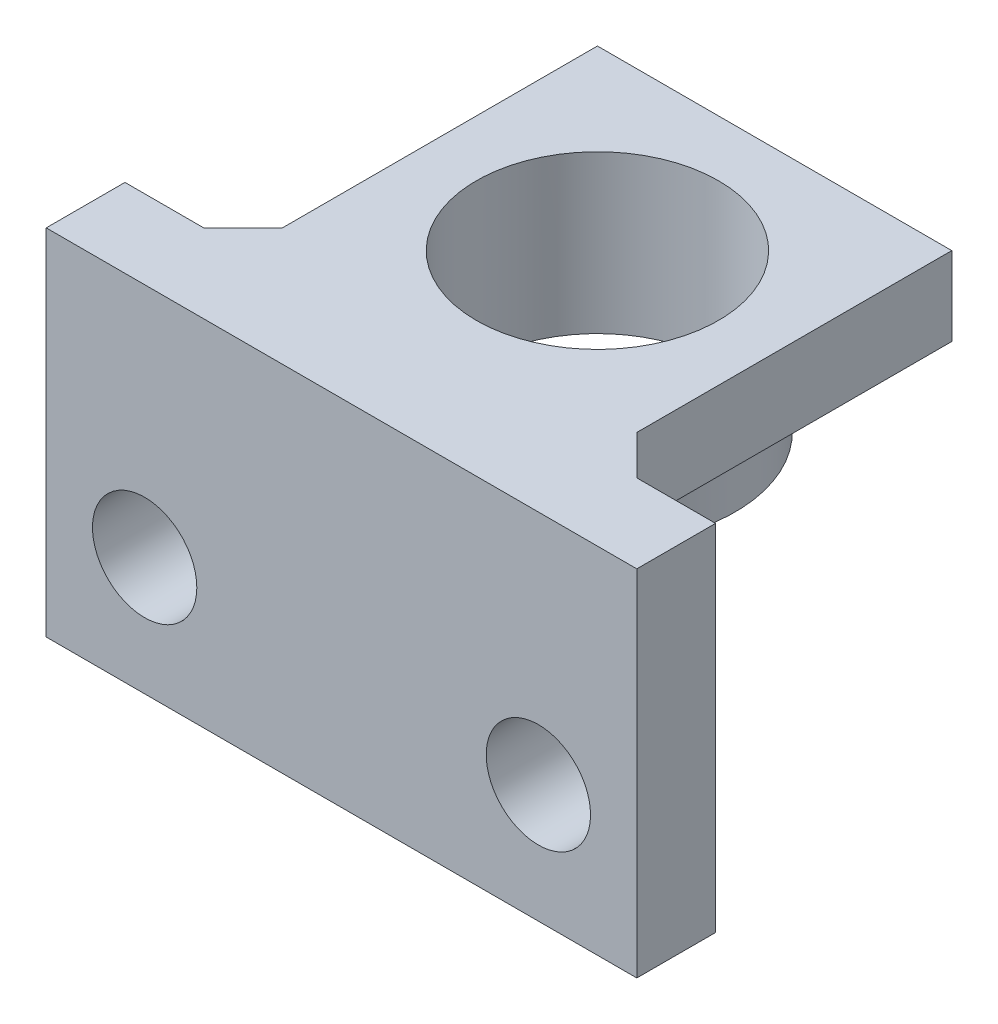
ISO-10303-21;
HEADER;
FILE_DESCRIPTION(('STEP AP214'),'2;1');
FILE_NAME('part.step','',(''),(''),'','','');
FILE_SCHEMA(('AUTOMOTIVE_DESIGN { 1 0 10303 214 1 1 1 1 }'));
ENDSEC;
DATA;
#1=APPLICATION_CONTEXT('core data for automotive mechanical design processes');
#2=APPLICATION_PROTOCOL_DEFINITION('international standard','automotive_design',2000,#1);
#3=PRODUCT_CONTEXT('',#1,'mechanical');
#4=PRODUCT('Part','Part','',(#3));
#5=PRODUCT_RELATED_PRODUCT_CATEGORY('part','',(#4));
#6=PRODUCT_DEFINITION_FORMATION('','',#4);
#7=PRODUCT_DEFINITION_CONTEXT('part definition',#1,'design');
#8=PRODUCT_DEFINITION('design','',#6,#7);
#9=PRODUCT_DEFINITION_SHAPE('','',#8);
#10=(LENGTH_UNIT() NAMED_UNIT(*) SI_UNIT(.MILLI.,.METRE.));
#11=(NAMED_UNIT(*) PLANE_ANGLE_UNIT() SI_UNIT($,.RADIAN.));
#12=(NAMED_UNIT(*) SI_UNIT($,.STERADIAN.) SOLID_ANGLE_UNIT());
#13=UNCERTAINTY_MEASURE_WITH_UNIT(LENGTH_MEASURE(1.E-05),#10,'distance_accuracy_value','');
#14=(GEOMETRIC_REPRESENTATION_CONTEXT(3) GLOBAL_UNCERTAINTY_ASSIGNED_CONTEXT((#13)) GLOBAL_UNIT_ASSIGNED_CONTEXT((#10,
#11,#12)) REPRESENTATION_CONTEXT('',''));
#15=CARTESIAN_POINT('',(0.,0.,0.));
#16=DIRECTION('',(0.,0.,1.));
#17=DIRECTION('',(1.,0.,0.));
#18=AXIS2_PLACEMENT_3D('',#15,#16,#17);
#19=CARTESIAN_POINT('',(0.,0.,0.));
#20=DIRECTION('',(0.,-1.,0.));
#21=DIRECTION('',(0.,0.,-1.));
#22=AXIS2_PLACEMENT_3D('',#19,#20,#21);
#23=PLANE('',#22);
#24=DIRECTION('',(0.,0.,-1.));
#25=VECTOR('',#24,1.);
#26=CARTESIAN_POINT('',(18.,0.,0.));
#27=LINE('',#26,#25);
#28=CARTESIAN_POINT('',(18.,0.,-2.00000000000002));
#29=VERTEX_POINT('',#28);
#30=CARTESIAN_POINT('',(18.,0.,-18.));
#31=VERTEX_POINT('',#30);
#32=EDGE_CURVE('E181',#29,#31,#27,.T.);
#33=ORIENTED_EDGE('',*,*,#32,.F.);
#34=DIRECTION('',(-1.,0.,0.));
#35=VECTOR('',#34,1.);
#36=CARTESIAN_POINT('',(0.,0.,-2.00000000000002));
#37=LINE('',#36,#35);
#38=CARTESIAN_POINT('',(9.,0.,-2.00000000000002));
#39=VERTEX_POINT('',#38);
#40=EDGE_CURVE('E66',#29,#39,#37,.T.);
#41=ORIENTED_EDGE('',*,*,#40,.T.);
#42=CARTESIAN_POINT('',(9.,0.,-9.));
#43=DIRECTION('',(0.,-1.,0.));
#44=DIRECTION('',(0.,0.,-1.));
#45=AXIS2_PLACEMENT_3D('',#42,#43,#44);
#46=CIRCLE('',#45,7.);
#47=EDGE_CURVE('E229',#39,#39,#46,.T.);
#48=ORIENTED_EDGE('',*,*,#47,.F.);
#49=DIRECTION('',(-1.,0.,0.));
#50=VECTOR('',#49,1.);
#51=CARTESIAN_POINT('',(0.,0.,-2.00000000000002));
#52=LINE('',#51,#50);
#53=CARTESIAN_POINT('',(0.,0.,-2.00000000000002));
#54=VERTEX_POINT('',#53);
#55=EDGE_CURVE('E206',#39,#54,#52,.T.);
#56=ORIENTED_EDGE('',*,*,#55,.T.);
#57=DIRECTION('',(0.,0.,1.));
#58=VECTOR('',#57,1.);
#59=CARTESIAN_POINT('',(0.,0.,0.));
#60=LINE('',#59,#58);
#61=CARTESIAN_POINT('',(0.,0.,-18.));
#62=VERTEX_POINT('',#61);
#63=EDGE_CURVE('E160',#62,#54,#60,.T.);
#64=ORIENTED_EDGE('',*,*,#63,.F.);
#65=DIRECTION('',(-1.,0.,0.));
#66=VECTOR('',#65,1.);
#67=CARTESIAN_POINT('',(0.,0.,-18.));
#68=LINE('',#67,#66);
#69=EDGE_CURVE('E171',#31,#62,#68,.T.);
#70=ORIENTED_EDGE('',*,*,#69,.F.);
#71=EDGE_LOOP('',(#33,#41,#48,#56,#64,#70));
#72=FACE_BOUND('',#71,.T.);
#73=ADVANCED_FACE('F41',(#72),#23,.T.);
#74=CARTESIAN_POINT('',(0.,4.,0.));
#75=DIRECTION('',(0.,-1.,0.));
#76=DIRECTION('',(0.,0.,-1.));
#77=AXIS2_PLACEMENT_3D('',#74,#75,#76);
#78=PLANE('',#77);
#79=DIRECTION('',(0.,0.,1.));
#80=VECTOR('',#79,1.);
#81=CARTESIAN_POINT('',(0.,4.,0.));
#82=LINE('',#81,#80);
#83=CARTESIAN_POINT('',(0.,4.,-18.));
#84=VERTEX_POINT('',#83);
#85=CARTESIAN_POINT('',(0.,4.,-2.00000000000002));
#86=VERTEX_POINT('',#85);
#87=EDGE_CURVE('E166',#84,#86,#82,.T.);
#88=ORIENTED_EDGE('',*,*,#87,.T.);
#89=DIRECTION('',(0.707106781186544,0.,-0.707106781186551));
#90=VECTOR('',#89,1.);
#91=CARTESIAN_POINT('',(-1.00000000000001,4.,-1.));
#92=LINE('',#91,#90);
#93=CARTESIAN_POINT('',(-2.,4.,0.));
#94=VERTEX_POINT('',#93);
#95=EDGE_CURVE('E52',#86,#94,#92,.F.);
#96=ORIENTED_EDGE('',*,*,#95,.T.);
#97=DIRECTION('',(-1.,0.,0.));
#98=VECTOR('',#97,1.);
#99=CARTESIAN_POINT('',(-6.,4.,0.));
#100=LINE('',#99,#98);
#101=CARTESIAN_POINT('',(-6.,4.,0.));
#102=VERTEX_POINT('',#101);
#103=EDGE_CURVE('E269',#94,#102,#100,.T.);
#104=ORIENTED_EDGE('',*,*,#103,.T.);
#105=DIRECTION('',(0.,0.,-1.));
#106=VECTOR('',#105,1.);
#107=CARTESIAN_POINT('',(-6.,4.,4.));
#108=LINE('',#107,#106);
#109=CARTESIAN_POINT('',(-6.,4.,4.));
#110=VERTEX_POINT('',#109);
#111=EDGE_CURVE('E260',#110,#102,#108,.T.);
#112=ORIENTED_EDGE('',*,*,#111,.F.);
#113=DIRECTION('',(-1.,0.,0.));
#114=VECTOR('',#113,1.);
#115=CARTESIAN_POINT('',(-6.,4.,4.));
#116=LINE('',#115,#114);
#117=CARTESIAN_POINT('',(24.,4.,4.));
#118=VERTEX_POINT('',#117);
#119=EDGE_CURVE('E144',#118,#110,#116,.T.);
#120=ORIENTED_EDGE('',*,*,#119,.F.);
#121=DIRECTION('',(0.,0.,-1.));
#122=VECTOR('',#121,1.);
#123=CARTESIAN_POINT('',(24.,4.,4.));
#124=LINE('',#123,#122);
#125=CARTESIAN_POINT('',(24.,4.,0.));
#126=VERTEX_POINT('',#125);
#127=EDGE_CURVE('E162',#118,#126,#124,.T.);
#128=ORIENTED_EDGE('',*,*,#127,.T.);
#129=CARTESIAN_POINT('',(20.,4.,0.));
#130=VERTEX_POINT('',#129);
#131=EDGE_CURVE('E149',#126,#130,#100,.T.);
#132=ORIENTED_EDGE('',*,*,#131,.T.);
#133=DIRECTION('',(0.707106781186544,0.,0.707106781186551));
#134=VECTOR('',#133,1.);
#135=CARTESIAN_POINT('',(10.0000000000001,4.,-10.));
#136=LINE('',#135,#134);
#137=CARTESIAN_POINT('',(18.,4.,-2.00000000000002));
#138=VERTEX_POINT('',#137);
#139=EDGE_CURVE('E11',#130,#138,#136,.F.);
#140=ORIENTED_EDGE('',*,*,#139,.T.);
#141=DIRECTION('',(0.,0.,-1.));
#142=VECTOR('',#141,1.);
#143=CARTESIAN_POINT('',(18.,4.,0.));
#144=LINE('',#143,#142);
#145=CARTESIAN_POINT('',(18.,4.,-18.));
#146=VERTEX_POINT('',#145);
#147=EDGE_CURVE('E170',#138,#146,#144,.T.);
#148=ORIENTED_EDGE('',*,*,#147,.T.);
#149=DIRECTION('',(-1.,0.,0.));
#150=VECTOR('',#149,1.);
#151=CARTESIAN_POINT('',(0.,4.,-18.));
#152=LINE('',#151,#150);
#153=EDGE_CURVE('E174',#146,#84,#152,.T.);
#154=ORIENTED_EDGE('',*,*,#153,.T.);
#155=EDGE_LOOP('',(#88,#96,#104,#112,#120,#128,#132,#140,#148,#154));
#156=FACE_BOUND('',#155,.T.);
#157=CARTESIAN_POINT('',(9.,4.,-9.));
#158=DIRECTION('',(0.,1.,0.));
#159=DIRECTION('',(0.,0.,1.));
#160=AXIS2_PLACEMENT_3D('',#157,#158,#159);
#161=CIRCLE('',#160,6.15);
#162=CARTESIAN_POINT('',(9.,4.,-2.85));
#163=VERTEX_POINT('',#162);
#164=EDGE_CURVE('E155',#163,#163,#161,.T.);
#165=ORIENTED_EDGE('',*,*,#164,.F.);
#166=EDGE_LOOP('',(#165));
#167=FACE_BOUND('',#166,.T.);
#168=ADVANCED_FACE('F277',(#156,#167),#78,.F.);
#169=CARTESIAN_POINT('',(0.,4.,0.));
#170=DIRECTION('',(1.,0.,0.));
#171=DIRECTION('',(0.,0.,-1.));
#172=AXIS2_PLACEMENT_3D('',#169,#170,#171);
#173=PLANE('',#172);
#174=ORIENTED_EDGE('',*,*,#63,.T.);
#175=DIRECTION('',(0.,1.,0.));
#176=VECTOR('',#175,1.);
#177=CARTESIAN_POINT('',(0.,4.,-2.00000000000002));
#178=LINE('',#177,#176);
#179=EDGE_CURVE('E203',#54,#86,#178,.T.);
#180=ORIENTED_EDGE('',*,*,#179,.T.);
#181=ORIENTED_EDGE('',*,*,#87,.F.);
#182=DIRECTION('',(0.,-1.,0.));
#183=VECTOR('',#182,1.);
#184=CARTESIAN_POINT('',(0.,4.,-18.));
#185=LINE('',#184,#183);
#186=EDGE_CURVE('E177',#84,#62,#185,.T.);
#187=ORIENTED_EDGE('',*,*,#186,.T.);
#188=EDGE_LOOP('',(#174,#180,#181,#187));
#189=FACE_BOUND('',#188,.T.);
#190=ADVANCED_FACE('F299',(#189),#173,.F.);
#191=CARTESIAN_POINT('',(18.,4.,0.));
#192=DIRECTION('',(-1.,0.,0.));
#193=DIRECTION('',(0.,0.,1.));
#194=AXIS2_PLACEMENT_3D('',#191,#192,#193);
#195=PLANE('',#194);
#196=ORIENTED_EDGE('',*,*,#147,.F.);
#197=DIRECTION('',(0.,-1.,0.));
#198=VECTOR('',#197,1.);
#199=CARTESIAN_POINT('',(18.,0.,-2.00000000000002));
#200=LINE('',#199,#198);
#201=EDGE_CURVE('E211',#138,#29,#200,.T.);
#202=ORIENTED_EDGE('',*,*,#201,.T.);
#203=ORIENTED_EDGE('',*,*,#32,.T.);
#204=DIRECTION('',(0.,-1.,0.));
#205=VECTOR('',#204,1.);
#206=CARTESIAN_POINT('',(18.,4.,-18.));
#207=LINE('',#206,#205);
#208=EDGE_CURVE('E189',#146,#31,#207,.T.);
#209=ORIENTED_EDGE('',*,*,#208,.F.);
#210=EDGE_LOOP('',(#196,#202,#203,#209));
#211=FACE_BOUND('',#210,.T.);
#212=ADVANCED_FACE('F289',(#211),#195,.F.);
#213=CARTESIAN_POINT('',(0.,4.,-18.));
#214=DIRECTION('',(0.,0.,1.));
#215=DIRECTION('',(1.,0.,0.));
#216=AXIS2_PLACEMENT_3D('',#213,#214,#215);
#217=PLANE('',#216);
#218=ORIENTED_EDGE('',*,*,#69,.T.);
#219=ORIENTED_EDGE('',*,*,#186,.F.);
#220=ORIENTED_EDGE('',*,*,#153,.F.);
#221=ORIENTED_EDGE('',*,*,#208,.T.);
#222=EDGE_LOOP('',(#218,#219,#220,#221));
#223=FACE_BOUND('',#222,.T.);
#224=ADVANCED_FACE('F295',(#223),#217,.F.);
#225=CARTESIAN_POINT('',(9.,4.,-9.));
#226=DIRECTION('',(0.,-1.,0.));
#227=DIRECTION('',(0.,0.,-1.));
#228=AXIS2_PLACEMENT_3D('',#225,#226,#227);
#229=CYLINDRICAL_SURFACE('',#228,6.15);
#230=ORIENTED_EDGE('',*,*,#164,.T.);
#231=EDGE_LOOP('',(#230));
#232=FACE_BOUND('',#231,.T.);
#233=CARTESIAN_POINT('',(9.,-4.,-9.));
#234=DIRECTION('',(0.,-1.,0.));
#235=DIRECTION('',(0.,0.,-1.));
#236=AXIS2_PLACEMENT_3D('',#233,#234,#235);
#237=CIRCLE('',#236,6.15);
#238=CARTESIAN_POINT('',(9.,-4.,-15.15));
#239=VERTEX_POINT('',#238);
#240=EDGE_CURVE('E224',#239,#239,#237,.T.);
#241=ORIENTED_EDGE('',*,*,#240,.T.);
#242=EDGE_LOOP('',(#241));
#243=FACE_BOUND('',#242,.T.);
#244=ADVANCED_FACE('F326',(#232,#243),#229,.F.);
#245=CARTESIAN_POINT('',(0.,0.,4.));
#246=DIRECTION('',(0.,0.,1.));
#247=DIRECTION('',(1.,0.,0.));
#248=AXIS2_PLACEMENT_3D('',#245,#246,#247);
#249=PLANE('',#248);
#250=CARTESIAN_POINT('',(-1.,-8.,4.));
#251=DIRECTION('',(0.,0.,1.));
#252=DIRECTION('',(1.,0.,0.));
#253=AXIS2_PLACEMENT_3D('',#250,#251,#252);
#254=CIRCLE('',#253,2.65);
#255=CARTESIAN_POINT('',(1.65,-8.,4.));
#256=VERTEX_POINT('',#255);
#257=EDGE_CURVE('E249',#256,#256,#254,.T.);
#258=ORIENTED_EDGE('',*,*,#257,.F.);
#259=EDGE_LOOP('',(#258));
#260=FACE_BOUND('',#259,.T.);
#261=DIRECTION('',(0.,-1.,0.));
#262=VECTOR('',#261,1.);
#263=CARTESIAN_POINT('',(-6.,4.,4.));
#264=LINE('',#263,#262);
#265=CARTESIAN_POINT('',(-6.,-14.,4.));
#266=VERTEX_POINT('',#265);
#267=EDGE_CURVE('E138',#110,#266,#264,.T.);
#268=ORIENTED_EDGE('',*,*,#267,.T.);
#269=DIRECTION('',(1.,0.,0.));
#270=VECTOR('',#269,1.);
#271=CARTESIAN_POINT('',(-6.,-14.,4.));
#272=LINE('',#271,#270);
#273=CARTESIAN_POINT('',(24.,-14.,4.));
#274=VERTEX_POINT('',#273);
#275=EDGE_CURVE('E126',#266,#274,#272,.T.);
#276=ORIENTED_EDGE('',*,*,#275,.T.);
#277=DIRECTION('',(0.,1.,0.));
#278=VECTOR('',#277,1.);
#279=CARTESIAN_POINT('',(24.,4.,4.));
#280=LINE('',#279,#278);
#281=EDGE_CURVE('E137',#274,#118,#280,.T.);
#282=ORIENTED_EDGE('',*,*,#281,.T.);
#283=ORIENTED_EDGE('',*,*,#119,.T.);
#284=EDGE_LOOP('',(#268,#276,#282,#283));
#285=FACE_BOUND('',#284,.T.);
#286=CARTESIAN_POINT('',(19.,-7.99999999999999,4.));
#287=DIRECTION('',(0.,0.,1.));
#288=DIRECTION('',(1.,0.,0.));
#289=AXIS2_PLACEMENT_3D('',#286,#287,#288);
#290=CIRCLE('',#289,2.65);
#291=CARTESIAN_POINT('',(21.65,-7.99999999999999,4.));
#292=VERTEX_POINT('',#291);
#293=EDGE_CURVE('E241',#292,#292,#290,.T.);
#294=ORIENTED_EDGE('',*,*,#293,.F.);
#295=EDGE_LOOP('',(#294));
#296=FACE_BOUND('',#295,.T.);
#297=ADVANCED_FACE('F141',(#260,#285,#296),#249,.T.);
#298=CARTESIAN_POINT('',(0.,0.,0.));
#299=DIRECTION('',(0.,0.,1.));
#300=DIRECTION('',(1.,0.,0.));
#301=AXIS2_PLACEMENT_3D('',#298,#299,#300);
#302=PLANE('',#301);
#303=ORIENTED_EDGE('',*,*,#103,.F.);
#304=DIRECTION('',(0.,-1.,0.));
#305=VECTOR('',#304,1.);
#306=CARTESIAN_POINT('',(-2.,0.,0.));
#307=LINE('',#306,#305);
#308=CARTESIAN_POINT('',(-2.,-2.,0.));
#309=VERTEX_POINT('',#308);
#310=EDGE_CURVE('E199',#94,#309,#307,.T.);
#311=ORIENTED_EDGE('',*,*,#310,.T.);
#312=DIRECTION('',(1.,0.,0.));
#313=VECTOR('',#312,1.);
#314=CARTESIAN_POINT('',(0.,-2.,0.));
#315=LINE('',#314,#313);
#316=CARTESIAN_POINT('',(20.,-2.,0.));
#317=VERTEX_POINT('',#316);
#318=EDGE_CURVE('E196',#309,#317,#315,.T.);
#319=ORIENTED_EDGE('',*,*,#318,.T.);
#320=DIRECTION('',(0.,1.,0.));
#321=VECTOR('',#320,1.);
#322=CARTESIAN_POINT('',(20.,4.,0.));
#323=LINE('',#322,#321);
#324=EDGE_CURVE('E193',#317,#130,#323,.T.);
#325=ORIENTED_EDGE('',*,*,#324,.T.);
#326=ORIENTED_EDGE('',*,*,#131,.F.);
#327=DIRECTION('',(0.,1.,0.));
#328=VECTOR('',#327,1.);
#329=CARTESIAN_POINT('',(24.,4.,0.));
#330=LINE('',#329,#328);
#331=CARTESIAN_POINT('',(24.,-14.,0.));
#332=VERTEX_POINT('',#331);
#333=EDGE_CURVE('E266',#332,#126,#330,.T.);
#334=ORIENTED_EDGE('',*,*,#333,.F.);
#335=DIRECTION('',(1.,0.,0.));
#336=VECTOR('',#335,1.);
#337=CARTESIAN_POINT('',(-6.,-14.,0.));
#338=LINE('',#337,#336);
#339=CARTESIAN_POINT('',(-6.,-14.,0.));
#340=VERTEX_POINT('',#339);
#341=EDGE_CURVE('E263',#340,#332,#338,.T.);
#342=ORIENTED_EDGE('',*,*,#341,.F.);
#343=DIRECTION('',(0.,-1.,0.));
#344=VECTOR('',#343,1.);
#345=CARTESIAN_POINT('',(-6.,4.,0.));
#346=LINE('',#345,#344);
#347=EDGE_CURVE('E153',#102,#340,#346,.T.);
#348=ORIENTED_EDGE('',*,*,#347,.F.);
#349=EDGE_LOOP('',(#303,#311,#319,#325,#326,#334,#342,#348));
#350=FACE_BOUND('',#349,.T.);
#351=CARTESIAN_POINT('',(-1.,-8.,0.));
#352=DIRECTION('',(0.,0.,1.));
#353=DIRECTION('',(1.,0.,0.));
#354=AXIS2_PLACEMENT_3D('',#351,#352,#353);
#355=CIRCLE('',#354,2.65);
#356=CARTESIAN_POINT('',(1.65,-8.,0.));
#357=VERTEX_POINT('',#356);
#358=EDGE_CURVE('E245',#357,#357,#355,.T.);
#359=ORIENTED_EDGE('',*,*,#358,.T.);
#360=EDGE_LOOP('',(#359));
#361=FACE_BOUND('',#360,.T.);
#362=CARTESIAN_POINT('',(19.,-7.99999999999999,0.));
#363=DIRECTION('',(0.,0.,1.));
#364=DIRECTION('',(1.,0.,0.));
#365=AXIS2_PLACEMENT_3D('',#362,#363,#364);
#366=CIRCLE('',#365,2.65);
#367=CARTESIAN_POINT('',(21.65,-7.99999999999999,0.));
#368=VERTEX_POINT('',#367);
#369=EDGE_CURVE('E239',#368,#368,#366,.T.);
#370=ORIENTED_EDGE('',*,*,#369,.T.);
#371=EDGE_LOOP('',(#370));
#372=FACE_BOUND('',#371,.T.);
#373=ADVANCED_FACE('F283',(#350,#361,#372),#302,.F.);
#374=CARTESIAN_POINT('',(-6.,4.,4.));
#375=DIRECTION('',(1.,0.,0.));
#376=DIRECTION('',(0.,1.,0.));
#377=AXIS2_PLACEMENT_3D('',#374,#375,#376);
#378=PLANE('',#377);
#379=ORIENTED_EDGE('',*,*,#347,.T.);
#380=DIRECTION('',(0.,0.,-1.));
#381=VECTOR('',#380,1.);
#382=CARTESIAN_POINT('',(-6.,-14.,4.));
#383=LINE('',#382,#381);
#384=EDGE_CURVE('E130',#266,#340,#383,.T.);
#385=ORIENTED_EDGE('',*,*,#384,.F.);
#386=ORIENTED_EDGE('',*,*,#267,.F.);
#387=ORIENTED_EDGE('',*,*,#111,.T.);
#388=EDGE_LOOP('',(#379,#385,#386,#387));
#389=FACE_BOUND('',#388,.T.);
#390=ADVANCED_FACE('F151',(#389),#378,.F.);
#391=CARTESIAN_POINT('',(-6.,-14.,4.));
#392=DIRECTION('',(0.,1.,0.));
#393=DIRECTION('',(-1.,0.,0.));
#394=AXIS2_PLACEMENT_3D('',#391,#392,#393);
#395=PLANE('',#394);
#396=ORIENTED_EDGE('',*,*,#341,.T.);
#397=DIRECTION('',(0.,0.,-1.));
#398=VECTOR('',#397,1.);
#399=CARTESIAN_POINT('',(24.,-14.,4.));
#400=LINE('',#399,#398);
#401=EDGE_CURVE('E133',#274,#332,#400,.T.);
#402=ORIENTED_EDGE('',*,*,#401,.F.);
#403=ORIENTED_EDGE('',*,*,#275,.F.);
#404=ORIENTED_EDGE('',*,*,#384,.T.);
#405=EDGE_LOOP('',(#396,#402,#403,#404));
#406=FACE_BOUND('',#405,.T.);
#407=ADVANCED_FACE('F128',(#406),#395,.F.);
#408=CARTESIAN_POINT('',(24.,4.,4.));
#409=DIRECTION('',(-1.,0.,0.));
#410=DIRECTION('',(0.,-1.,0.));
#411=AXIS2_PLACEMENT_3D('',#408,#409,#410);
#412=PLANE('',#411);
#413=ORIENTED_EDGE('',*,*,#333,.T.);
#414=ORIENTED_EDGE('',*,*,#127,.F.);
#415=ORIENTED_EDGE('',*,*,#281,.F.);
#416=ORIENTED_EDGE('',*,*,#401,.T.);
#417=EDGE_LOOP('',(#413,#414,#415,#416));
#418=FACE_BOUND('',#417,.T.);
#419=ADVANCED_FACE('F303',(#418),#412,.F.);
#420=CARTESIAN_POINT('',(-1.,-8.,4.));
#421=DIRECTION('',(0.,0.,-1.));
#422=DIRECTION('',(-1.,0.,0.));
#423=AXIS2_PLACEMENT_3D('',#420,#421,#422);
#424=CYLINDRICAL_SURFACE('',#423,2.65);
#425=ORIENTED_EDGE('',*,*,#257,.T.);
#426=EDGE_LOOP('',(#425));
#427=FACE_BOUND('',#426,.T.);
#428=ORIENTED_EDGE('',*,*,#358,.F.);
#429=EDGE_LOOP('',(#428));
#430=FACE_BOUND('',#429,.T.);
#431=ADVANCED_FACE('F305',(#427,#430),#424,.F.);
#432=CARTESIAN_POINT('',(19.,-7.99999999999999,4.));
#433=DIRECTION('',(0.,0.,-1.));
#434=DIRECTION('',(-1.,0.,0.));
#435=AXIS2_PLACEMENT_3D('',#432,#433,#434);
#436=CYLINDRICAL_SURFACE('',#435,2.65);
#437=ORIENTED_EDGE('',*,*,#293,.T.);
#438=EDGE_LOOP('',(#437));
#439=FACE_BOUND('',#438,.T.);
#440=ORIENTED_EDGE('',*,*,#369,.F.);
#441=EDGE_LOOP('',(#440));
#442=FACE_BOUND('',#441,.T.);
#443=ADVANCED_FACE('F311',(#439,#442),#436,.F.);
#444=CARTESIAN_POINT('',(9.,-4.,-9.));
#445=DIRECTION('',(0.,-1.,0.));
#446=DIRECTION('',(0.,0.,-1.));
#447=AXIS2_PLACEMENT_3D('',#444,#445,#446);
#448=PLANE('',#447);
#449=CARTESIAN_POINT('',(9.,-4.,-9.));
#450=DIRECTION('',(0.,-1.,0.));
#451=DIRECTION('',(0.,0.,-1.));
#452=AXIS2_PLACEMENT_3D('',#449,#450,#451);
#453=CIRCLE('',#452,7.);
#454=CARTESIAN_POINT('',(9.,-4.,-16.));
#455=VERTEX_POINT('',#454);
#456=EDGE_CURVE('E234',#455,#455,#453,.T.);
#457=ORIENTED_EDGE('',*,*,#456,.T.);
#458=EDGE_LOOP('',(#457));
#459=FACE_BOUND('',#458,.T.);
#460=ORIENTED_EDGE('',*,*,#240,.F.);
#461=EDGE_LOOP('',(#460));
#462=FACE_BOUND('',#461,.T.);
#463=ADVANCED_FACE('F347',(#459,#462),#448,.T.);
#464=CARTESIAN_POINT('',(9.,-4.,-9.));
#465=DIRECTION('',(0.,1.,0.));
#466=DIRECTION('',(0.,0.,1.));
#467=AXIS2_PLACEMENT_3D('',#464,#465,#466);
#468=CYLINDRICAL_SURFACE('',#467,7.);
#469=ORIENTED_EDGE('',*,*,#456,.F.);
#470=EDGE_LOOP('',(#469));
#471=FACE_BOUND('',#470,.T.);
#472=ORIENTED_EDGE('',*,*,#47,.T.);
#473=EDGE_LOOP('',(#472));
#474=FACE_BOUND('',#473,.T.);
#475=ADVANCED_FACE('F343',(#471,#474),#468,.T.);
#476=CARTESIAN_POINT('',(18.,4.,-2.00000000000002));
#477=DIRECTION('',(0.707106781186551,0.,-0.707106781186544));
#478=DIRECTION('',(0.,1.,0.));
#479=AXIS2_PLACEMENT_3D('',#476,#477,#478);
#480=PLANE('',#479);
#481=ORIENTED_EDGE('',*,*,#139,.F.);
#482=ORIENTED_EDGE('',*,*,#324,.F.);
#483=DIRECTION('',(0.577350269189624,-0.577350269189624,0.57735026918963));
#484=VECTOR('',#483,1.);
#485=CARTESIAN_POINT('',(16.6666666666667,1.33333333333332,-3.33333333333336));
#486=LINE('',#485,#484);
#487=EDGE_CURVE('E46',#29,#317,#486,.T.);
#488=ORIENTED_EDGE('',*,*,#487,.F.);
#489=ORIENTED_EDGE('',*,*,#201,.F.);
#490=EDGE_LOOP('',(#481,#482,#488,#489));
#491=FACE_BOUND('',#490,.T.);
#492=ADVANCED_FACE('F44',(#491),#480,.T.);
#493=CARTESIAN_POINT('',(0.,-2.,0.));
#494=DIRECTION('',(0.,0.707106781186551,0.707106781186544));
#495=DIRECTION('',(1.,0.,0.));
#496=AXIS2_PLACEMENT_3D('',#493,#494,#495);
#497=PLANE('',#496);
#498=ORIENTED_EDGE('',*,*,#487,.T.);
#499=ORIENTED_EDGE('',*,*,#318,.F.);
#500=DIRECTION('',(-0.577350269189624,-0.577350269189624,0.57735026918963));
#501=VECTOR('',#500,1.);
#502=CARTESIAN_POINT('',(-1.33333333333334,-1.33333333333334,-0.666666666666669));
#503=LINE('',#502,#501);
#504=EDGE_CURVE('E215',#54,#309,#503,.T.);
#505=ORIENTED_EDGE('',*,*,#504,.F.);
#506=ORIENTED_EDGE('',*,*,#55,.F.);
#507=ORIENTED_EDGE('',*,*,#40,.F.);
#508=EDGE_LOOP('',(#498,#499,#505,#506,#507));
#509=FACE_BOUND('',#508,.T.);
#510=ADVANCED_FACE('F336',(#509),#497,.F.);
#511=CARTESIAN_POINT('',(-2.,0.,0.));
#512=DIRECTION('',(-0.707106781186551,0.,-0.707106781186544));
#513=DIRECTION('',(0.,1.,0.));
#514=AXIS2_PLACEMENT_3D('',#511,#512,#513);
#515=PLANE('',#514);
#516=ORIENTED_EDGE('',*,*,#95,.F.);
#517=ORIENTED_EDGE('',*,*,#179,.F.);
#518=ORIENTED_EDGE('',*,*,#504,.T.);
#519=ORIENTED_EDGE('',*,*,#310,.F.);
#520=EDGE_LOOP('',(#516,#517,#518,#519));
#521=FACE_BOUND('',#520,.T.);
#522=ADVANCED_FACE('F301',(#521),#515,.T.);
#523=CLOSED_SHELL('',(#73,#168,#190,#212,#224,#244,#297,#373,#390,#407,#419,#431,#443,#463,#475,
#492,#510,#522));
#524=MANIFOLD_SOLID_BREP('B2',#523);
#525=ADVANCED_BREP_SHAPE_REPRESENTATION('',(#18,#524),#14);
#526=SHAPE_DEFINITION_REPRESENTATION(#9,#525);
ENDSEC;
END-ISO-10303-21;
